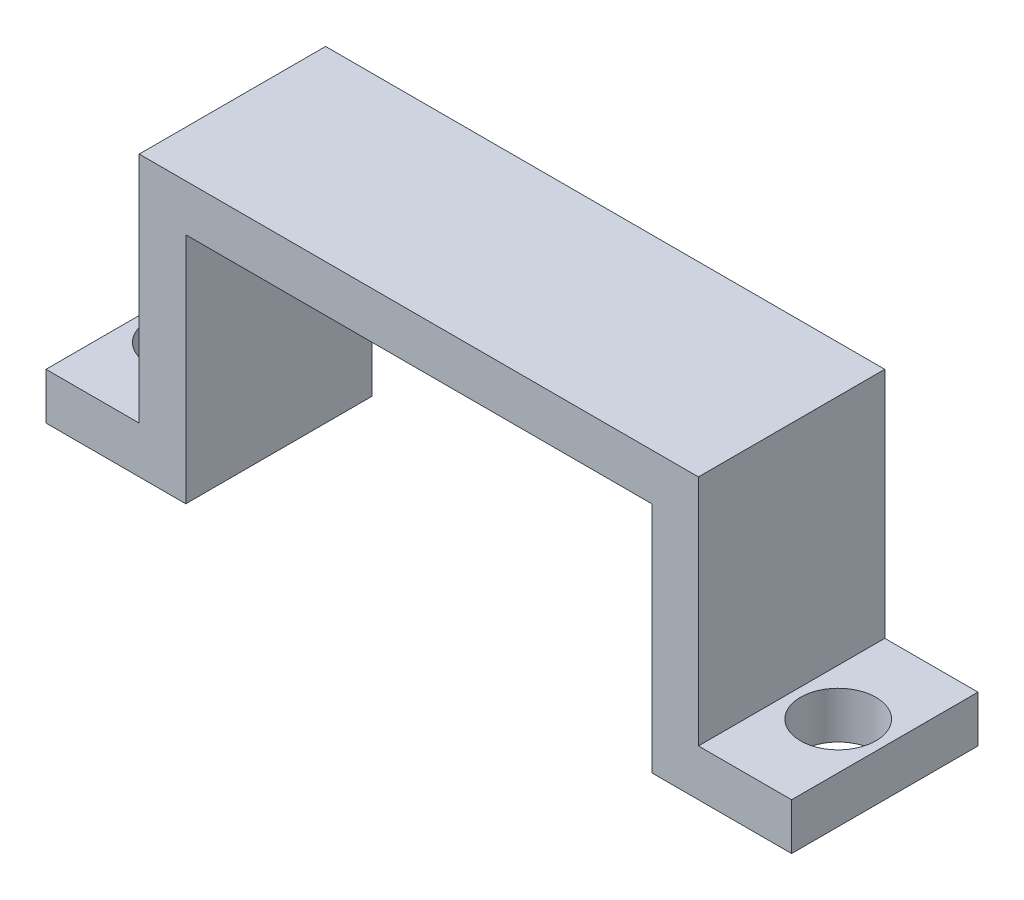
ISO-10303-21;
HEADER;
FILE_DESCRIPTION(('STEP AP214'),'2;1');
FILE_NAME('part.step','',(''),(''),'','','');
FILE_SCHEMA(('AUTOMOTIVE_DESIGN { 1 0 10303 214 1 1 1 1 }'));
ENDSEC;
DATA;
#1=APPLICATION_CONTEXT('core data for automotive mechanical design processes');
#2=APPLICATION_PROTOCOL_DEFINITION('international standard','automotive_design',2000,#1);
#3=PRODUCT_CONTEXT('',#1,'mechanical');
#4=PRODUCT('Part','Part','',(#3));
#5=PRODUCT_RELATED_PRODUCT_CATEGORY('part','',(#4));
#6=PRODUCT_DEFINITION_FORMATION('','',#4);
#7=PRODUCT_DEFINITION_CONTEXT('part definition',#1,'design');
#8=PRODUCT_DEFINITION('design','',#6,#7);
#9=PRODUCT_DEFINITION_SHAPE('','',#8);
#10=(LENGTH_UNIT() NAMED_UNIT(*) SI_UNIT(.MILLI.,.METRE.));
#11=(NAMED_UNIT(*) PLANE_ANGLE_UNIT() SI_UNIT($,.RADIAN.));
#12=(NAMED_UNIT(*) SI_UNIT($,.STERADIAN.) SOLID_ANGLE_UNIT());
#13=UNCERTAINTY_MEASURE_WITH_UNIT(LENGTH_MEASURE(1.E-05),#10,'distance_accuracy_value','');
#14=(GEOMETRIC_REPRESENTATION_CONTEXT(3) GLOBAL_UNCERTAINTY_ASSIGNED_CONTEXT((#13)) GLOBAL_UNIT_ASSIGNED_CONTEXT((#10,
#11,#12)) REPRESENTATION_CONTEXT('',''));
#15=CARTESIAN_POINT('',(0.,0.,0.));
#16=DIRECTION('',(0.,0.,1.));
#17=DIRECTION('',(1.,0.,0.));
#18=AXIS2_PLACEMENT_3D('',#15,#16,#17);
#19=CARTESIAN_POINT('',(0.,5.,0.));
#20=DIRECTION('',(1.,0.,0.));
#21=DIRECTION('',(0.,0.,-1.));
#22=AXIS2_PLACEMENT_3D('',#19,#20,#21);
#23=PLANE('',#22);
#24=DIRECTION('',(0.,0.,-1.));
#25=VECTOR('',#24,1.);
#26=CARTESIAN_POINT('',(0.,-20.,-20.));
#27=LINE('',#26,#25);
#28=CARTESIAN_POINT('',(0.,-20.,0.));
#29=VERTEX_POINT('',#28);
#30=CARTESIAN_POINT('',(0.,-20.,-20.));
#31=VERTEX_POINT('',#30);
#32=EDGE_CURVE('E57',#29,#31,#27,.T.);
#33=ORIENTED_EDGE('',*,*,#32,.F.);
#34=DIRECTION('',(0.,-1.,0.));
#35=VECTOR('',#34,1.);
#36=CARTESIAN_POINT('',(0.,5.,0.));
#37=LINE('',#36,#35);
#38=CARTESIAN_POINT('',(0.,5.,0.));
#39=VERTEX_POINT('',#38);
#40=EDGE_CURVE('E12',#39,#29,#37,.T.);
#41=ORIENTED_EDGE('',*,*,#40,.F.);
#42=DIRECTION('',(0.,0.,1.));
#43=VECTOR('',#42,1.);
#44=CARTESIAN_POINT('',(0.,5.,0.));
#45=LINE('',#44,#43);
#46=CARTESIAN_POINT('',(0.,5.,-20.));
#47=VERTEX_POINT('',#46);
#48=EDGE_CURVE('E210',#47,#39,#45,.T.);
#49=ORIENTED_EDGE('',*,*,#48,.F.);
#50=DIRECTION('',(0.,-1.,0.));
#51=VECTOR('',#50,1.);
#52=CARTESIAN_POINT('',(0.,5.,-20.));
#53=LINE('',#52,#51);
#54=EDGE_CURVE('E220',#47,#31,#53,.T.);
#55=ORIENTED_EDGE('',*,*,#54,.T.);
#56=EDGE_LOOP('',(#33,#41,#49,#55));
#57=FACE_BOUND('',#56,.T.);
#58=ADVANCED_FACE('F43',(#57),#23,.F.);
#59=CARTESIAN_POINT('',(60.,5.,0.));
#60=DIRECTION('',(-1.,0.,0.));
#61=DIRECTION('',(0.,0.,1.));
#62=AXIS2_PLACEMENT_3D('',#59,#60,#61);
#63=PLANE('',#62);
#64=DIRECTION('',(0.,0.,1.));
#65=VECTOR('',#64,1.);
#66=CARTESIAN_POINT('',(60.,-20.,0.));
#67=LINE('',#66,#65);
#68=CARTESIAN_POINT('',(60.,-20.,-20.));
#69=VERTEX_POINT('',#68);
#70=CARTESIAN_POINT('',(60.,-20.,0.));
#71=VERTEX_POINT('',#70);
#72=EDGE_CURVE('E64',#69,#71,#67,.T.);
#73=ORIENTED_EDGE('',*,*,#72,.F.);
#74=DIRECTION('',(0.,-1.,0.));
#75=VECTOR('',#74,1.);
#76=CARTESIAN_POINT('',(60.,5.,-20.));
#77=LINE('',#76,#75);
#78=CARTESIAN_POINT('',(60.,5.,-20.));
#79=VERTEX_POINT('',#78);
#80=EDGE_CURVE('E225',#79,#69,#77,.T.);
#81=ORIENTED_EDGE('',*,*,#80,.F.);
#82=DIRECTION('',(0.,0.,-1.));
#83=VECTOR('',#82,1.);
#84=CARTESIAN_POINT('',(60.,5.,0.));
#85=LINE('',#84,#83);
#86=CARTESIAN_POINT('',(60.,5.,0.));
#87=VERTEX_POINT('',#86);
#88=EDGE_CURVE('E216',#87,#79,#85,.T.);
#89=ORIENTED_EDGE('',*,*,#88,.F.);
#90=DIRECTION('',(0.,-1.,0.));
#91=VECTOR('',#90,1.);
#92=CARTESIAN_POINT('',(60.,5.,0.));
#93=LINE('',#92,#91);
#94=EDGE_CURVE('E50',#87,#71,#93,.T.);
#95=ORIENTED_EDGE('',*,*,#94,.T.);
#96=EDGE_LOOP('',(#73,#81,#89,#95));
#97=FACE_BOUND('',#96,.T.);
#98=ADVANCED_FACE('F228',(#97),#63,.F.);
#99=CARTESIAN_POINT('',(0.,0.,0.));
#100=DIRECTION('',(0.,-1.,0.));
#101=DIRECTION('',(0.,0.,-1.));
#102=AXIS2_PLACEMENT_3D('',#99,#100,#101);
#103=PLANE('',#102);
#104=DIRECTION('',(-1.,0.,0.));
#105=VECTOR('',#104,1.);
#106=CARTESIAN_POINT('',(0.,0.,-20.));
#107=LINE('',#106,#105);
#108=CARTESIAN_POINT('',(55.,0.,-20.));
#109=VERTEX_POINT('',#108);
#110=CARTESIAN_POINT('',(5.,0.,-20.));
#111=VERTEX_POINT('',#110);
#112=EDGE_CURVE('E214',#109,#111,#107,.T.);
#113=ORIENTED_EDGE('',*,*,#112,.F.);
#114=DIRECTION('',(0.,0.,-1.));
#115=VECTOR('',#114,1.);
#116=CARTESIAN_POINT('',(55.,0.,0.));
#117=LINE('',#116,#115);
#118=CARTESIAN_POINT('',(55.,0.,0.));
#119=VERTEX_POINT('',#118);
#120=EDGE_CURVE('E188',#119,#109,#117,.T.);
#121=ORIENTED_EDGE('',*,*,#120,.F.);
#122=DIRECTION('',(1.,0.,0.));
#123=VECTOR('',#122,1.);
#124=CARTESIAN_POINT('',(0.,0.,0.));
#125=LINE('',#124,#123);
#126=CARTESIAN_POINT('',(5.,0.,0.));
#127=VERTEX_POINT('',#126);
#128=EDGE_CURVE('E209',#127,#119,#125,.T.);
#129=ORIENTED_EDGE('',*,*,#128,.F.);
#130=DIRECTION('',(0.,0.,1.));
#131=VECTOR('',#130,1.);
#132=CARTESIAN_POINT('',(5.,0.,0.));
#133=LINE('',#132,#131);
#134=EDGE_CURVE('E143',#111,#127,#133,.T.);
#135=ORIENTED_EDGE('',*,*,#134,.F.);
#136=EDGE_LOOP('',(#113,#121,#129,#135));
#137=FACE_BOUND('',#136,.T.);
#138=ADVANCED_FACE('F266',(#137),#103,.T.);
#139=CARTESIAN_POINT('',(0.,5.,0.));
#140=DIRECTION('',(0.,0.,-1.));
#141=DIRECTION('',(-1.,0.,0.));
#142=AXIS2_PLACEMENT_3D('',#139,#140,#141);
#143=PLANE('',#142);
#144=ORIENTED_EDGE('',*,*,#40,.T.);
#145=DIRECTION('',(1.,0.,0.));
#146=VECTOR('',#145,1.);
#147=CARTESIAN_POINT('',(-10.,-20.,0.));
#148=LINE('',#147,#146);
#149=CARTESIAN_POINT('',(-10.,-20.,0.));
#150=VERTEX_POINT('',#149);
#151=EDGE_CURVE('E168',#150,#29,#148,.T.);
#152=ORIENTED_EDGE('',*,*,#151,.F.);
#153=DIRECTION('',(0.,1.,0.));
#154=VECTOR('',#153,1.);
#155=CARTESIAN_POINT('',(-10.,-25.,0.));
#156=LINE('',#155,#154);
#157=CARTESIAN_POINT('',(-10.,-25.,0.));
#158=VERTEX_POINT('',#157);
#159=EDGE_CURVE('E152',#158,#150,#156,.T.);
#160=ORIENTED_EDGE('',*,*,#159,.F.);
#161=DIRECTION('',(-1.,0.,0.));
#162=VECTOR('',#161,1.);
#163=CARTESIAN_POINT('',(0.,-25.,0.));
#164=LINE('',#163,#162);
#165=CARTESIAN_POINT('',(5.,-25.,0.));
#166=VERTEX_POINT('',#165);
#167=EDGE_CURVE('E149',#166,#158,#164,.T.);
#168=ORIENTED_EDGE('',*,*,#167,.F.);
#169=DIRECTION('',(0.,1.,0.));
#170=VECTOR('',#169,1.);
#171=CARTESIAN_POINT('',(5.,-25.,0.));
#172=LINE('',#171,#170);
#173=EDGE_CURVE('E203',#166,#127,#172,.T.);
#174=ORIENTED_EDGE('',*,*,#173,.T.);
#175=ORIENTED_EDGE('',*,*,#128,.T.);
#176=DIRECTION('',(0.,1.,0.));
#177=VECTOR('',#176,1.);
#178=CARTESIAN_POINT('',(55.,-25.,0.));
#179=LINE('',#178,#177);
#180=CARTESIAN_POINT('',(55.,-25.,0.));
#181=VERTEX_POINT('',#180);
#182=EDGE_CURVE('E199',#181,#119,#179,.T.);
#183=ORIENTED_EDGE('',*,*,#182,.F.);
#184=DIRECTION('',(-1.,0.,0.));
#185=VECTOR('',#184,1.);
#186=CARTESIAN_POINT('',(60.,-25.,0.));
#187=LINE('',#186,#185);
#188=CARTESIAN_POINT('',(70.,-25.,0.));
#189=VERTEX_POINT('',#188);
#190=EDGE_CURVE('E189',#189,#181,#187,.T.);
#191=ORIENTED_EDGE('',*,*,#190,.F.);
#192=DIRECTION('',(0.,-1.,0.));
#193=VECTOR('',#192,1.);
#194=CARTESIAN_POINT('',(70.,-25.,0.));
#195=LINE('',#194,#193);
#196=CARTESIAN_POINT('',(70.,-20.,0.));
#197=VERTEX_POINT('',#196);
#198=EDGE_CURVE('E171',#197,#189,#195,.T.);
#199=ORIENTED_EDGE('',*,*,#198,.F.);
#200=DIRECTION('',(-1.,0.,0.));
#201=VECTOR('',#200,1.);
#202=CARTESIAN_POINT('',(70.,-20.,0.));
#203=LINE('',#202,#201);
#204=EDGE_CURVE('E181',#197,#71,#203,.T.);
#205=ORIENTED_EDGE('',*,*,#204,.T.);
#206=ORIENTED_EDGE('',*,*,#94,.F.);
#207=DIRECTION('',(1.,0.,0.));
#208=VECTOR('',#207,1.);
#209=CARTESIAN_POINT('',(0.,5.,0.));
#210=LINE('',#209,#208);
#211=EDGE_CURVE('E213',#39,#87,#210,.T.);
#212=ORIENTED_EDGE('',*,*,#211,.F.);
#213=EDGE_LOOP('',(#144,#152,#160,#168,#174,#175,#183,#191,#199,#205,#206,#212));
#214=FACE_BOUND('',#213,.T.);
#215=ADVANCED_FACE('F236',(#214),#143,.F.);
#216=CARTESIAN_POINT('',(0.,5.,-20.));
#217=DIRECTION('',(0.,0.,1.));
#218=DIRECTION('',(1.,0.,0.));
#219=AXIS2_PLACEMENT_3D('',#216,#217,#218);
#220=PLANE('',#219);
#221=ORIENTED_EDGE('',*,*,#80,.T.);
#222=DIRECTION('',(-1.,0.,0.));
#223=VECTOR('',#222,1.);
#224=CARTESIAN_POINT('',(70.,-20.,-20.));
#225=LINE('',#224,#223);
#226=CARTESIAN_POINT('',(70.,-20.,-20.));
#227=VERTEX_POINT('',#226);
#228=EDGE_CURVE('E185',#227,#69,#225,.T.);
#229=ORIENTED_EDGE('',*,*,#228,.F.);
#230=DIRECTION('',(0.,1.,0.));
#231=VECTOR('',#230,1.);
#232=CARTESIAN_POINT('',(70.,-25.,-20.));
#233=LINE('',#232,#231);
#234=CARTESIAN_POINT('',(70.,-25.,-20.));
#235=VERTEX_POINT('',#234);
#236=EDGE_CURVE('E177',#235,#227,#233,.T.);
#237=ORIENTED_EDGE('',*,*,#236,.F.);
#238=DIRECTION('',(1.,0.,0.));
#239=VECTOR('',#238,1.);
#240=CARTESIAN_POINT('',(60.,-25.,-20.));
#241=LINE('',#240,#239);
#242=CARTESIAN_POINT('',(55.,-25.,-20.));
#243=VERTEX_POINT('',#242);
#244=EDGE_CURVE('E193',#243,#235,#241,.T.);
#245=ORIENTED_EDGE('',*,*,#244,.F.);
#246=DIRECTION('',(0.,1.,0.));
#247=VECTOR('',#246,1.);
#248=CARTESIAN_POINT('',(55.,-25.,-20.));
#249=LINE('',#248,#247);
#250=EDGE_CURVE('E195',#243,#109,#249,.T.);
#251=ORIENTED_EDGE('',*,*,#250,.T.);
#252=ORIENTED_EDGE('',*,*,#112,.T.);
#253=DIRECTION('',(0.,1.,0.));
#254=VECTOR('',#253,1.);
#255=CARTESIAN_POINT('',(5.,-25.,-20.));
#256=LINE('',#255,#254);
#257=CARTESIAN_POINT('',(5.,-25.,-20.));
#258=VERTEX_POINT('',#257);
#259=EDGE_CURVE('E139',#258,#111,#256,.T.);
#260=ORIENTED_EDGE('',*,*,#259,.F.);
#261=DIRECTION('',(1.,0.,0.));
#262=VECTOR('',#261,1.);
#263=CARTESIAN_POINT('',(0.,-25.,-20.));
#264=LINE('',#263,#262);
#265=CARTESIAN_POINT('',(-10.,-25.,-20.));
#266=VERTEX_POINT('',#265);
#267=EDGE_CURVE('E132',#266,#258,#264,.T.);
#268=ORIENTED_EDGE('',*,*,#267,.F.);
#269=DIRECTION('',(0.,-1.,0.));
#270=VECTOR('',#269,1.);
#271=CARTESIAN_POINT('',(-10.,-25.,-20.));
#272=LINE('',#271,#270);
#273=CARTESIAN_POINT('',(-10.,-20.,-20.));
#274=VERTEX_POINT('',#273);
#275=EDGE_CURVE('E137',#274,#266,#272,.T.);
#276=ORIENTED_EDGE('',*,*,#275,.F.);
#277=DIRECTION('',(1.,0.,0.));
#278=VECTOR('',#277,1.);
#279=CARTESIAN_POINT('',(-10.,-20.,-20.));
#280=LINE('',#279,#278);
#281=EDGE_CURVE('E165',#274,#31,#280,.T.);
#282=ORIENTED_EDGE('',*,*,#281,.T.);
#283=ORIENTED_EDGE('',*,*,#54,.F.);
#284=DIRECTION('',(-1.,0.,0.));
#285=VECTOR('',#284,1.);
#286=CARTESIAN_POINT('',(0.,5.,-20.));
#287=LINE('',#286,#285);
#288=EDGE_CURVE('E218',#79,#47,#287,.T.);
#289=ORIENTED_EDGE('',*,*,#288,.F.);
#290=EDGE_LOOP('',(#221,#229,#237,#245,#251,#252,#260,#268,#276,#282,#283,#289));
#291=FACE_BOUND('',#290,.T.);
#292=ADVANCED_FACE('F134',(#291),#220,.F.);
#293=CARTESIAN_POINT('',(0.,5.,0.));
#294=DIRECTION('',(0.,-1.,0.));
#295=DIRECTION('',(0.,0.,-1.));
#296=AXIS2_PLACEMENT_3D('',#293,#294,#295);
#297=PLANE('',#296);
#298=ORIENTED_EDGE('',*,*,#48,.T.);
#299=ORIENTED_EDGE('',*,*,#211,.T.);
#300=ORIENTED_EDGE('',*,*,#88,.T.);
#301=ORIENTED_EDGE('',*,*,#288,.T.);
#302=EDGE_LOOP('',(#298,#299,#300,#301));
#303=FACE_BOUND('',#302,.T.);
#304=ADVANCED_FACE('F247',(#303),#297,.F.);
#305=CARTESIAN_POINT('',(5.,-25.,0.));
#306=DIRECTION('',(-1.,0.,0.));
#307=DIRECTION('',(0.,0.,1.));
#308=AXIS2_PLACEMENT_3D('',#305,#306,#307);
#309=PLANE('',#308);
#310=ORIENTED_EDGE('',*,*,#134,.T.);
#311=ORIENTED_EDGE('',*,*,#173,.F.);
#312=DIRECTION('',(0.,0.,1.));
#313=VECTOR('',#312,1.);
#314=CARTESIAN_POINT('',(5.,-25.,0.));
#315=LINE('',#314,#313);
#316=EDGE_CURVE('E142',#258,#166,#315,.T.);
#317=ORIENTED_EDGE('',*,*,#316,.F.);
#318=ORIENTED_EDGE('',*,*,#259,.T.);
#319=EDGE_LOOP('',(#310,#311,#317,#318));
#320=FACE_BOUND('',#319,.T.);
#321=ADVANCED_FACE('F281',(#320),#309,.F.);
#322=CARTESIAN_POINT('',(0.,-25.,0.));
#323=DIRECTION('',(0.,-1.,0.));
#324=DIRECTION('',(0.,0.,-1.));
#325=AXIS2_PLACEMENT_3D('',#322,#323,#324);
#326=PLANE('',#325);
#327=CARTESIAN_POINT('',(-5.,-25.,-10.));
#328=DIRECTION('',(0.,-1.,0.));
#329=DIRECTION('',(0.,0.,-1.));
#330=AXIS2_PLACEMENT_3D('',#327,#328,#329);
#331=CIRCLE('',#330,4.05);
#332=CARTESIAN_POINT('',(-5.,-25.,-14.05));
#333=VERTEX_POINT('',#332);
#334=EDGE_CURVE('E159',#333,#333,#331,.T.);
#335=ORIENTED_EDGE('',*,*,#334,.F.);
#336=EDGE_LOOP('',(#335));
#337=FACE_BOUND('',#336,.T.);
#338=ORIENTED_EDGE('',*,*,#167,.T.);
#339=DIRECTION('',(0.,0.,1.));
#340=VECTOR('',#339,1.);
#341=CARTESIAN_POINT('',(-10.,-25.,-20.));
#342=LINE('',#341,#340);
#343=EDGE_CURVE('E146',#266,#158,#342,.T.);
#344=ORIENTED_EDGE('',*,*,#343,.F.);
#345=ORIENTED_EDGE('',*,*,#267,.T.);
#346=ORIENTED_EDGE('',*,*,#316,.T.);
#347=EDGE_LOOP('',(#338,#344,#345,#346));
#348=FACE_BOUND('',#347,.T.);
#349=ADVANCED_FACE('F147',(#337,#348),#326,.T.);
#350=CARTESIAN_POINT('',(55.,-25.,0.));
#351=DIRECTION('',(1.,0.,0.));
#352=DIRECTION('',(0.,0.,-1.));
#353=AXIS2_PLACEMENT_3D('',#350,#351,#352);
#354=PLANE('',#353);
#355=ORIENTED_EDGE('',*,*,#120,.T.);
#356=ORIENTED_EDGE('',*,*,#250,.F.);
#357=DIRECTION('',(0.,0.,-1.));
#358=VECTOR('',#357,1.);
#359=CARTESIAN_POINT('',(55.,-25.,0.));
#360=LINE('',#359,#358);
#361=EDGE_CURVE('E191',#181,#243,#360,.T.);
#362=ORIENTED_EDGE('',*,*,#361,.F.);
#363=ORIENTED_EDGE('',*,*,#182,.T.);
#364=EDGE_LOOP('',(#355,#356,#362,#363));
#365=FACE_BOUND('',#364,.T.);
#366=ADVANCED_FACE('F291',(#365),#354,.F.);
#367=CARTESIAN_POINT('',(0.,-25.,0.));
#368=DIRECTION('',(0.,1.,0.));
#369=DIRECTION('',(0.,0.,1.));
#370=AXIS2_PLACEMENT_3D('',#367,#368,#369);
#371=PLANE('',#370);
#372=CARTESIAN_POINT('',(65.,-25.,-10.));
#373=DIRECTION('',(0.,1.,0.));
#374=DIRECTION('',(0.,0.,1.));
#375=AXIS2_PLACEMENT_3D('',#372,#373,#374);
#376=CIRCLE('',#375,4.05);
#377=CARTESIAN_POINT('',(65.,-25.,-5.95));
#378=VERTEX_POINT('',#377);
#379=EDGE_CURVE('E308',#378,#378,#376,.T.);
#380=ORIENTED_EDGE('',*,*,#379,.T.);
#381=EDGE_LOOP('',(#380));
#382=FACE_BOUND('',#381,.T.);
#383=ORIENTED_EDGE('',*,*,#244,.T.);
#384=DIRECTION('',(0.,0.,-1.));
#385=VECTOR('',#384,1.);
#386=CARTESIAN_POINT('',(70.,-25.,0.));
#387=LINE('',#386,#385);
#388=EDGE_CURVE('E174',#189,#235,#387,.T.);
#389=ORIENTED_EDGE('',*,*,#388,.F.);
#390=ORIENTED_EDGE('',*,*,#190,.T.);
#391=ORIENTED_EDGE('',*,*,#361,.T.);
#392=EDGE_LOOP('',(#383,#389,#390,#391));
#393=FACE_BOUND('',#392,.T.);
#394=ADVANCED_FACE('F295',(#382,#393),#371,.F.);
#395=CARTESIAN_POINT('',(70.,-20.,0.));
#396=DIRECTION('',(0.,-1.,0.));
#397=DIRECTION('',(0.,0.,-1.));
#398=AXIS2_PLACEMENT_3D('',#395,#396,#397);
#399=PLANE('',#398);
#400=CARTESIAN_POINT('',(65.,-20.,-10.));
#401=DIRECTION('',(0.,1.,0.));
#402=DIRECTION('',(0.,0.,1.));
#403=AXIS2_PLACEMENT_3D('',#400,#401,#402);
#404=CIRCLE('',#403,4.05);
#405=CARTESIAN_POINT('',(65.,-20.,-5.95));
#406=VERTEX_POINT('',#405);
#407=EDGE_CURVE('E306',#406,#406,#404,.T.);
#408=ORIENTED_EDGE('',*,*,#407,.F.);
#409=EDGE_LOOP('',(#408));
#410=FACE_BOUND('',#409,.T.);
#411=ORIENTED_EDGE('',*,*,#72,.T.);
#412=ORIENTED_EDGE('',*,*,#204,.F.);
#413=DIRECTION('',(0.,0.,1.));
#414=VECTOR('',#413,1.);
#415=CARTESIAN_POINT('',(70.,-20.,0.));
#416=LINE('',#415,#414);
#417=EDGE_CURVE('E179',#227,#197,#416,.T.);
#418=ORIENTED_EDGE('',*,*,#417,.F.);
#419=ORIENTED_EDGE('',*,*,#228,.T.);
#420=EDGE_LOOP('',(#411,#412,#418,#419));
#421=FACE_BOUND('',#420,.T.);
#422=ADVANCED_FACE('F232',(#410,#421),#399,.F.);
#423=CARTESIAN_POINT('',(70.,0.,0.));
#424=DIRECTION('',(-1.,0.,0.));
#425=DIRECTION('',(0.,0.,1.));
#426=AXIS2_PLACEMENT_3D('',#423,#424,#425);
#427=PLANE('',#426);
#428=ORIENTED_EDGE('',*,*,#198,.T.);
#429=ORIENTED_EDGE('',*,*,#388,.T.);
#430=ORIENTED_EDGE('',*,*,#236,.T.);
#431=ORIENTED_EDGE('',*,*,#417,.T.);
#432=EDGE_LOOP('',(#428,#429,#430,#431));
#433=FACE_BOUND('',#432,.T.);
#434=ADVANCED_FACE('F240',(#433),#427,.F.);
#435=CARTESIAN_POINT('',(-10.,-20.,-20.));
#436=DIRECTION('',(0.,-1.,0.));
#437=DIRECTION('',(0.,0.,-1.));
#438=AXIS2_PLACEMENT_3D('',#435,#436,#437);
#439=PLANE('',#438);
#440=CARTESIAN_POINT('',(-5.,-20.,-10.));
#441=DIRECTION('',(0.,1.,0.));
#442=DIRECTION('',(0.,0.,1.));
#443=AXIS2_PLACEMENT_3D('',#440,#441,#442);
#444=CIRCLE('',#443,4.05);
#445=CARTESIAN_POINT('',(-5.,-20.,-5.95));
#446=VERTEX_POINT('',#445);
#447=EDGE_CURVE('E311',#446,#446,#444,.T.);
#448=ORIENTED_EDGE('',*,*,#447,.F.);
#449=EDGE_LOOP('',(#448));
#450=FACE_BOUND('',#449,.T.);
#451=ORIENTED_EDGE('',*,*,#32,.T.);
#452=ORIENTED_EDGE('',*,*,#281,.F.);
#453=DIRECTION('',(0.,0.,-1.));
#454=VECTOR('',#453,1.);
#455=CARTESIAN_POINT('',(-10.,-20.,-20.));
#456=LINE('',#455,#454);
#457=EDGE_CURVE('E156',#150,#274,#456,.T.);
#458=ORIENTED_EDGE('',*,*,#457,.F.);
#459=ORIENTED_EDGE('',*,*,#151,.T.);
#460=EDGE_LOOP('',(#451,#452,#458,#459));
#461=FACE_BOUND('',#460,.T.);
#462=ADVANCED_FACE('F250',(#450,#461),#439,.F.);
#463=CARTESIAN_POINT('',(-10.,0.,0.));
#464=DIRECTION('',(1.,0.,0.));
#465=DIRECTION('',(0.,0.,-1.));
#466=AXIS2_PLACEMENT_3D('',#463,#464,#465);
#467=PLANE('',#466);
#468=ORIENTED_EDGE('',*,*,#275,.T.);
#469=ORIENTED_EDGE('',*,*,#343,.T.);
#470=ORIENTED_EDGE('',*,*,#159,.T.);
#471=ORIENTED_EDGE('',*,*,#457,.T.);
#472=EDGE_LOOP('',(#468,#469,#470,#471));
#473=FACE_BOUND('',#472,.T.);
#474=ADVANCED_FACE('F154',(#473),#467,.F.);
#475=CARTESIAN_POINT('',(-5.,-40.,-10.));
#476=DIRECTION('',(0.,1.,0.));
#477=DIRECTION('',(0.,0.,1.));
#478=AXIS2_PLACEMENT_3D('',#475,#476,#477);
#479=CYLINDRICAL_SURFACE('',#478,4.05);
#480=ORIENTED_EDGE('',*,*,#334,.T.);
#481=EDGE_LOOP('',(#480));
#482=FACE_BOUND('',#481,.T.);
#483=ORIENTED_EDGE('',*,*,#447,.T.);
#484=EDGE_LOOP('',(#483));
#485=FACE_BOUND('',#484,.T.);
#486=ADVANCED_FACE('F258',(#482,#485),#479,.F.);
#487=CARTESIAN_POINT('',(65.,-40.,-10.));
#488=DIRECTION('',(0.,1.,0.));
#489=DIRECTION('',(0.,0.,1.));
#490=AXIS2_PLACEMENT_3D('',#487,#488,#489);
#491=CYLINDRICAL_SURFACE('',#490,4.05);
#492=ORIENTED_EDGE('',*,*,#407,.T.);
#493=EDGE_LOOP('',(#492));
#494=FACE_BOUND('',#493,.T.);
#495=ORIENTED_EDGE('',*,*,#379,.F.);
#496=EDGE_LOOP('',(#495));
#497=FACE_BOUND('',#496,.T.);
#498=ADVANCED_FACE('F319',(#494,#497),#491,.F.);
#499=CLOSED_SHELL('',(#58,#98,#138,#215,#292,#304,#321,#349,#366,#394,#422,#434,#462,#474,#486,#498));
#500=MANIFOLD_SOLID_BREP('B2',#499);
#501=ADVANCED_BREP_SHAPE_REPRESENTATION('',(#18,#500),#14);
#502=SHAPE_DEFINITION_REPRESENTATION(#9,#501);
ENDSEC;
END-ISO-10303-21;
